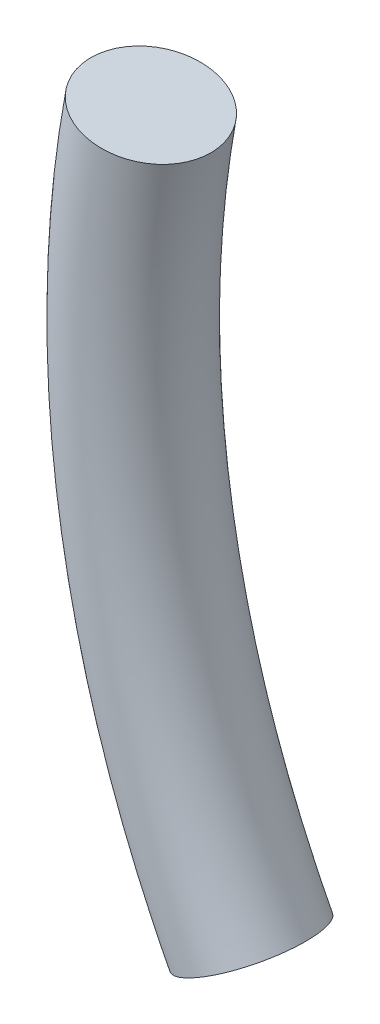
ISO-10303-21;
HEADER;
FILE_DESCRIPTION(('STEP AP214'),'2;1');
FILE_NAME('part.step','',(''),(''),'','','');
FILE_SCHEMA(('AUTOMOTIVE_DESIGN { 1 0 10303 214 1 1 1 1 }'));
ENDSEC;
DATA;
#1=APPLICATION_CONTEXT('core data for automotive mechanical design processes');
#2=APPLICATION_PROTOCOL_DEFINITION('international standard','automotive_design',2000,#1);
#3=PRODUCT_CONTEXT('',#1,'mechanical');
#4=PRODUCT('Part','Part','',(#3));
#5=PRODUCT_RELATED_PRODUCT_CATEGORY('part','',(#4));
#6=PRODUCT_DEFINITION_FORMATION('','',#4);
#7=PRODUCT_DEFINITION_CONTEXT('part definition',#1,'design');
#8=PRODUCT_DEFINITION('design','',#6,#7);
#9=PRODUCT_DEFINITION_SHAPE('','',#8);
#10=(LENGTH_UNIT() NAMED_UNIT(*) SI_UNIT(.MILLI.,.METRE.));
#11=(NAMED_UNIT(*) PLANE_ANGLE_UNIT() SI_UNIT($,.RADIAN.));
#12=(NAMED_UNIT(*) SI_UNIT($,.STERADIAN.) SOLID_ANGLE_UNIT());
#13=UNCERTAINTY_MEASURE_WITH_UNIT(LENGTH_MEASURE(1.E-05),#10,'distance_accuracy_value','');
#14=(GEOMETRIC_REPRESENTATION_CONTEXT(3) GLOBAL_UNCERTAINTY_ASSIGNED_CONTEXT((#13)) GLOBAL_UNIT_ASSIGNED_CONTEXT((#10,
#11,#12)) REPRESENTATION_CONTEXT('',''));
#15=CARTESIAN_POINT('',(0.,0.,0.));
#16=DIRECTION('',(0.,0.,1.));
#17=DIRECTION('',(1.,0.,0.));
#18=AXIS2_PLACEMENT_3D('',#15,#16,#17);
#19=CARTESIAN_POINT('',(0.,0.,-107.5));
#20=DIRECTION('',(0.182886749288035,0.983133987274805,0.));
#21=DIRECTION('',(-0.983133987274805,0.182886749288035,0.));
#22=AXIS2_PLACEMENT_3D('',#19,#20,#21);
#23=PLANE('',#22);
#24=CARTESIAN_POINT('',(-7.13969187066761,1.3281557285636,-102.2302));
#25=CARTESIAN_POINT('',(-7.13969005611854,1.32815539101349,-102.25265524156));
#26=CARTESIAN_POINT('',(-7.13782603214446,1.32780863737703,-102.275130857259));
#27=CARTESIAN_POINT('',(-7.13041033974896,1.32642913886158,-102.319482451298));
#28=CARTESIAN_POINT('',(-7.1248507789372,1.32539492580671,-102.341357041711));
#29=CARTESIAN_POINT('',(-7.11020964362788,1.32267131979037,-102.383809618347));
#30=CARTESIAN_POINT('',(-7.10113435530587,1.32098309620992,-102.404389843003));
#31=CARTESIAN_POINT('',(-7.07970254820175,1.31699626065812,-102.443737337222));
#32=CARTESIAN_POINT('',(-7.0673413746271,1.31469678278256,-102.46250198299));
#33=CARTESIAN_POINT('',(-7.03971500733899,1.30955760890254,-102.497627484938));
#34=CARTESIAN_POINT('',(-7.02445393305132,1.30671867921113,-102.513991693303));
#35=CARTESIAN_POINT('',(-6.99142572735941,1.30057463246674,-102.543904884907));
#36=CARTESIAN_POINT('',(-6.97365511762952,1.2972688683609,-102.557449895039));
#37=CARTESIAN_POINT('',(-6.93614302902663,1.29029071072177,-102.581301941874));
#38=CARTESIAN_POINT('',(-6.91640299508213,1.28661858598021,-102.5916113298));
#39=CARTESIAN_POINT('',(-6.8755003023688,1.27900969380041,-102.608713483024));
#40=CARTESIAN_POINT('',(-6.85433755998862,1.27507291080844,-102.615506041437));
#41=CARTESIAN_POINT('',(-6.81119193830921,1.26704677948037,-102.625380612929));
#42=CARTESIAN_POINT('',(-6.78920908314733,1.2629574356344,-102.628462735124));
#43=CARTESIAN_POINT('',(-6.74504667005647,1.25474215646041,-102.630829316177));
#44=CARTESIAN_POINT('',(-6.72286711212749,1.25061622113238,-102.630113775036));
#45=CARTESIAN_POINT('',(-6.6789402506196,1.24244476026175,-102.624905254934));
#46=CARTESIAN_POINT('',(-6.65719295977223,1.23839923708752,-102.620412164882));
#47=CARTESIAN_POINT('',(-6.61474996716512,1.23050381179611,-102.607776350926));
#48=CARTESIAN_POINT('',(-6.59405420362914,1.22665389818706,-102.599633841699));
#49=CARTESIAN_POINT('',(-6.55428574908882,1.21925600179733,-102.579923114515));
#50=CARTESIAN_POINT('',(-6.53521425212156,1.21570824113648,-102.568352403919));
#51=CARTESIAN_POINT('',(-6.49927871317527,1.2090233599434,-102.542134850302));
#52=CARTESIAN_POINT('',(-6.48241162256708,1.20588567229227,-102.527492330157));
#53=CARTESIAN_POINT('',(-6.45130956160618,1.20009993515072,-102.495513974748));
#54=CARTESIAN_POINT('',(-6.43707834157821,1.1974525833116,-102.478174365578));
#55=CARTESIAN_POINT('',(-6.41170039649541,1.19273167045549,-102.441335318358));
#56=CARTESIAN_POINT('',(-6.4005493134671,1.19065729874982,-102.421838987082));
#57=CARTESIAN_POINT('',(-6.38160367793182,1.18713295136574,-102.381186262625));
#58=CARTESIAN_POINT('',(-6.37381514555994,1.18568409557838,-102.36002697154));
#59=CARTESIAN_POINT('',(-6.36185877606581,1.1834599210728,-102.316713490036));
#60=CARTESIAN_POINT('',(-6.35768323362395,1.18268316897838,-102.294561523395));
#61=CARTESIAN_POINT('',(-6.35391028715783,1.18198130949295,-102.258269762147));
#62=CARTESIAN_POINT('',(-6.35318354640415,1.18184611809916,-102.244238862857));
#63=CARTESIAN_POINT('',(-6.35318649539683,1.18184666668327,-102.20774475844));
#64=CARTESIAN_POINT('',(-6.35505051937092,1.18219342031973,-102.185269142741));
#65=CARTESIAN_POINT('',(-6.36246621176641,1.18357291883518,-102.140917548703));
#66=CARTESIAN_POINT('',(-6.36802577257818,1.18460713189006,-102.119042958289));
#67=CARTESIAN_POINT('',(-6.3826669078875,1.1873307379064,-102.076590381653));
#68=CARTESIAN_POINT('',(-6.3917421962095,1.18901896148685,-102.056010156997));
#69=CARTESIAN_POINT('',(-6.41317400331363,1.19300579703864,-102.016662662778));
#70=CARTESIAN_POINT('',(-6.42553517688828,1.19530527491421,-101.99789801701));
#71=CARTESIAN_POINT('',(-6.45316154417639,1.20044444879422,-101.962772515062));
#72=CARTESIAN_POINT('',(-6.46842261846406,1.20328337848564,-101.946408306697));
#73=CARTESIAN_POINT('',(-6.50145082415597,1.20942742523002,-101.916495115093));
#74=CARTESIAN_POINT('',(-6.51922143388585,1.21273318933587,-101.902950104961));
#75=CARTESIAN_POINT('',(-6.55673352248874,1.21971134697499,-101.879098058126));
#76=CARTESIAN_POINT('',(-6.57647355643324,1.22338347171656,-101.8687886702));
#77=CARTESIAN_POINT('',(-6.61737624914657,1.23099236389635,-101.851686516976));
#78=CARTESIAN_POINT('',(-6.63853899152676,1.23492914688833,-101.844893958563));
#79=CARTESIAN_POINT('',(-6.68168461320617,1.2429552782164,-101.835019387071));
#80=CARTESIAN_POINT('',(-6.70366746836805,1.24704462206237,-101.831937264876));
#81=CARTESIAN_POINT('',(-6.74782988145891,1.25525990123636,-101.829570683823));
#82=CARTESIAN_POINT('',(-6.77000943938789,1.25938583656438,-101.830286224964));
#83=CARTESIAN_POINT('',(-6.81393630089578,1.26755729743501,-101.835494745066));
#84=CARTESIAN_POINT('',(-6.83568359174315,1.27160282060925,-101.839987835118));
#85=CARTESIAN_POINT('',(-6.87812658435026,1.27949824590065,-101.852623649074));
#86=CARTESIAN_POINT('',(-6.89882234788624,1.2833481595097,-101.860766158301));
#87=CARTESIAN_POINT('',(-6.93859080242655,1.29074605589944,-101.880476885485));
#88=CARTESIAN_POINT('',(-6.95766229939381,1.29429381656029,-101.892047596081));
#89=CARTESIAN_POINT('',(-6.99359783834011,1.30097869775336,-101.918265149698));
#90=CARTESIAN_POINT('',(-7.0104649289483,1.30411638540449,-101.932907669844));
#91=CARTESIAN_POINT('',(-7.04156698990919,1.30990212254604,-101.964886025252));
#92=CARTESIAN_POINT('',(-7.05579820993717,1.31254947438517,-101.982225634422));
#93=CARTESIAN_POINT('',(-7.08117615501996,1.31727038724128,-102.019064681642));
#94=CARTESIAN_POINT('',(-7.09232723804828,1.31934475894695,-102.038561012918));
#95=CARTESIAN_POINT('',(-7.11127287358356,1.32286910633102,-102.079213737375));
#96=CARTESIAN_POINT('',(-7.11906140595543,1.32431796211838,-102.10037302846));
#97=CARTESIAN_POINT('',(-7.13101777544957,1.32654213662397,-102.143686509964));
#98=CARTESIAN_POINT('',(-7.13519331789143,1.32731888871838,-102.165838476605));
#99=CARTESIAN_POINT('',(-7.13896626435754,1.32802074820382,-102.202130237853));
#100=CARTESIAN_POINT('',(-7.13969300511123,1.32815593959761,-102.216161137143));
#101=CARTESIAN_POINT('',(-7.13969187066761,1.3281557285636,-102.2302));
#102=B_SPLINE_CURVE_WITH_KNOTS('',3,(#24,#25,#26,#27,#28,#29,#30,#31,#32,#33,#34,#35,#36,#37,
#38,#39,#40,#41,#42,#43,#44,#45,#46,#47,#48,#49,#50,#51,#52,#53,#54,#55,#56,#57,#58,#59,#60,#61,
#62,#63,#64,#65,#66,#67,#68,#69,#70,#71,#72,#73,#74,#75,#76,#77,#78,#79,#80,#81,#82,#83,#84,#85,
#86,#87,#88,#89,#90,#91,#92,#93,#94,#95,#96,#97,#98,#99,#100,#101),.UNSPECIFIED.,.T.,.F.,(4,2,2,
2,2,2,2,2,2,2,2,2,2,2,2,2,2,2,2,2,2,2,2,2,2,2,2,2,2,2,2,2,2,2,2,2,2,2,4),(0.,0.0673217190940813,
0.134787678055445,0.202133559490878,0.269575356418609,0.336922056232666,0.404363034793442,
0.471754892083641,0.539150713403541,0.606544552708794,0.673938392014053,0.741334213333949,
0.808726070624147,0.876167049184931,0.943513748998995,1.01095554592845,1.07830142736559,
1.1457673863287,1.21308910542448,1.25517818200736,1.32249990110144,1.3899658600628,
1.45731174149823,1.52475353842596,1.59210023824002,1.6595412168008,1.726933074091,
1.7943288954109,1.86172273471615,1.92911657402141,1.9965123953413,2.0639042526315,
2.13134523119229,2.19869193100635,2.2661337279358,2.33347960937294,2.40094556833606,
2.46826728743184,2.51035636401471),.UNSPECIFIED.);
#103=CARTESIAN_POINT('',(-7.13969187066761,1.3281557285636,-102.2302));
#104=VERTEX_POINT('',#103);
#105=EDGE_CURVE('E19',#104,#104,#102,.T.);
#106=ORIENTED_EDGE('',*,*,#105,.F.);
#107=EDGE_LOOP('',(#106));
#108=FACE_BOUND('',#107,.T.);
#109=ADVANCED_FACE('F15',(#108),#23,.T.);
#110=CARTESIAN_POINT('',(0.,0.,-107.5));
#111=DIRECTION('',(-0.461160995917257,0.887316480092985,0.));
#112=DIRECTION('',(-0.887316480092985,-0.461160995917257,0.));
#113=AXIS2_PLACEMENT_3D('',#110,#111,#112);
#114=PLANE('',#113);
#115=CARTESIAN_POINT('',(-5.73399510275987,-2.98010343715953,-102.2302));
#116=CARTESIAN_POINT('',(-5.73399674046065,-2.98010428831438,-102.25265524156));
#117=CARTESIAN_POINT('',(-5.7356790942526,-2.98097865046992,-102.275130857259));
#118=CARTESIAN_POINT('',(-5.74237204369692,-2.98445714692593,-102.319482451298));
#119=CARTESIAN_POINT('',(-5.74738976253709,-2.98706498332871,-102.341357041711));
#120=CARTESIAN_POINT('',(-5.76060395390407,-2.99393273546422,-102.383809618347));
#121=CARTESIAN_POINT('',(-5.76879475291411,-2.99818970252566,-102.404389843003));
#122=CARTESIAN_POINT('',(-5.78813778843908,-3.00824277121861,-102.443737337222));
#123=CARTESIAN_POINT('',(-5.79929422608445,-3.01404105628471,-102.46250198299));
#124=CARTESIAN_POINT('',(-5.8242280919635,-3.02699982204509,-102.497627484938));
#125=CARTESIAN_POINT('',(-5.83800180225594,-3.03415837043052,-102.513991693303));
#126=CARTESIAN_POINT('',(-5.86781103639662,-3.04965098936892,-102.543904884907));
#127=CARTESIAN_POINT('',(-5.88384969956839,-3.05798669150837,-102.557449895039));
#128=CARTESIAN_POINT('',(-5.91770581160488,-3.07558257606018,-102.581301941874));
#129=CARTESIAN_POINT('',(-5.93552195636568,-3.08484208069649,-102.5916113298));
#130=CARTESIAN_POINT('',(-5.97243821986027,-3.10402840397646,-102.608713483024));
#131=CARTESIAN_POINT('',(-5.99153841405653,-3.11395526183989,-102.615506041437));
#132=CARTESIAN_POINT('',(-6.03047900776555,-3.1341936811405,-102.625380612929));
#133=CARTESIAN_POINT('',(-6.05031938549341,-3.14450523125551,-102.628462735124));
#134=CARTESIAN_POINT('',(-6.09017767281071,-3.16522059931998,-102.630829316177));
#135=CARTESIAN_POINT('',(-6.11019558240014,-3.17562441726944,-102.630113775036));
#136=CARTESIAN_POINT('',(-6.14984127529573,-3.19622929459308,-102.624905254934));
#137=CARTESIAN_POINT('',(-6.16946904711118,-3.20643034799525,-102.620412164882));
#138=CARTESIAN_POINT('',(-6.20777549088406,-3.22633918340705,-102.607776350926));
#139=CARTESIAN_POINT('',(-6.22645421859694,-3.23604699439421,-102.599633841699));
#140=CARTESIAN_POINT('',(-6.26234678823464,-3.25470127787875,-102.579923114515));
#141=CARTESIAN_POINT('',(-6.27955955249478,-3.2636471902863,-102.568352403919));
#142=CARTESIAN_POINT('',(-6.31199276743882,-3.28050355894388,-102.542134850302));
#143=CARTESIAN_POINT('',(-6.32721596962854,-3.28841544522162,-102.527492330157));
#144=CARTESIAN_POINT('',(-6.35528678358947,-3.30300456287339,-102.495513974748));
#145=CARTESIAN_POINT('',(-6.36813101054744,-3.30968003507369,-102.478174365578));
#146=CARTESIAN_POINT('',(-6.39103558835099,-3.32158412808664,-102.441335318358));
#147=CARTESIAN_POINT('',(-6.40109987243636,-3.32681479310428,-102.421838987082));
#148=CARTESIAN_POINT('',(-6.41819904188211,-3.33570166739082,-102.381186262625));
#149=CARTESIAN_POINT('',(-6.42522849383754,-3.33935505278064,-102.36002697154));
#150=CARTESIAN_POINT('',(-6.4360195801305,-3.34496345543464,-102.316713490036));
#151=CARTESIAN_POINT('',(-6.43978816881724,-3.3469220870514,-102.294561523395));
#152=CARTESIAN_POINT('',(-6.4431933990516,-3.34869187201701,-102.258269762147));
#153=CARTESIAN_POINT('',(-6.44384931071354,-3.3490327660295,-102.244238862857));
#154=CARTESIAN_POINT('',(-6.44384664913349,-3.3490313827385,-102.20774475844));
#155=CARTESIAN_POINT('',(-6.44216429534153,-3.34815702058295,-102.185269142741));
#156=CARTESIAN_POINT('',(-6.43547134589721,-3.34467852412694,-102.140917548703));
#157=CARTESIAN_POINT('',(-6.43045362705704,-3.34207068772417,-102.119042958289));
#158=CARTESIAN_POINT('',(-6.41723943569006,-3.33520293558865,-102.076590381653));
#159=CARTESIAN_POINT('',(-6.40904863668002,-3.33094596852721,-102.056010156997));
#160=CARTESIAN_POINT('',(-6.38970560115505,-3.32089289983426,-102.016662662778));
#161=CARTESIAN_POINT('',(-6.37854916350968,-3.31509461476816,-101.99789801701));
#162=CARTESIAN_POINT('',(-6.35361529763063,-3.30213584900778,-101.962772515062));
#163=CARTESIAN_POINT('',(-6.33984158733819,-3.29497730062235,-101.946408306697));
#164=CARTESIAN_POINT('',(-6.31003235319751,-3.27948468168395,-101.916495115093));
#165=CARTESIAN_POINT('',(-6.29399369002573,-3.2711489795445,-101.902950104961));
#166=CARTESIAN_POINT('',(-6.26013757798925,-3.25355309499269,-101.879098058126));
#167=CARTESIAN_POINT('',(-6.24232143322845,-3.24429359035638,-101.8687886702));
#168=CARTESIAN_POINT('',(-6.20540516973387,-3.22510726707641,-101.851686516976));
#169=CARTESIAN_POINT('',(-6.1863049755376,-3.21518040921298,-101.844893958563));
#170=CARTESIAN_POINT('',(-6.14736438182857,-3.19494198991237,-101.835019387071));
#171=CARTESIAN_POINT('',(-6.12752400410071,-3.18463043979736,-101.831937264876));
#172=CARTESIAN_POINT('',(-6.08766571678342,-3.16391507173289,-101.829570683823));
#173=CARTESIAN_POINT('',(-6.06764780719399,-3.15351125378343,-101.830286224964));
#174=CARTESIAN_POINT('',(-6.0280021142984,-3.13290637645979,-101.835494745066));
#175=CARTESIAN_POINT('',(-6.00837434248295,-3.12270532305762,-101.839987835118));
#176=CARTESIAN_POINT('',(-5.97006789871007,-3.10279648764582,-101.852623649074));
#177=CARTESIAN_POINT('',(-5.95138917099719,-3.09308867665866,-101.860766158301));
#178=CARTESIAN_POINT('',(-5.91549660135949,-3.07443439317413,-101.880476885485));
#179=CARTESIAN_POINT('',(-5.89828383709935,-3.06548848076657,-101.892047596081));
#180=CARTESIAN_POINT('',(-5.86585062215531,-3.04863211210899,-101.918265149698));
#181=CARTESIAN_POINT('',(-5.85062741996559,-3.04072022583125,-101.932907669844));
#182=CARTESIAN_POINT('',(-5.82255660600466,-3.02613110817948,-101.964886025252));
#183=CARTESIAN_POINT('',(-5.80971237904669,-3.01945563597918,-101.982225634422));
#184=CARTESIAN_POINT('',(-5.78680780124313,-3.00755154296623,-102.019064681642));
#185=CARTESIAN_POINT('',(-5.77674351715778,-3.00232087794859,-102.038561012918));
#186=CARTESIAN_POINT('',(-5.75964434771202,-2.99343400366205,-102.079213737375));
#187=CARTESIAN_POINT('',(-5.75261489575659,-2.98978061827223,-102.10037302846));
#188=CARTESIAN_POINT('',(-5.74182380946362,-2.98417221561823,-102.143686509964));
#189=CARTESIAN_POINT('',(-5.73805522077688,-2.98221358400147,-102.165838476605));
#190=CARTESIAN_POINT('',(-5.73464999054253,-2.98044379903586,-102.202130237853));
#191=CARTESIAN_POINT('',(-5.73399407888059,-2.98010290502337,-102.216161137143));
#192=CARTESIAN_POINT('',(-5.73399510275987,-2.98010343715953,-102.2302));
#193=B_SPLINE_CURVE_WITH_KNOTS('',3,(#115,#116,#117,#118,#119,#120,#121,#122,#123,#124,#125,
#126,#127,#128,#129,#130,#131,#132,#133,#134,#135,#136,#137,#138,#139,#140,#141,#142,#143,#144,
#145,#146,#147,#148,#149,#150,#151,#152,#153,#154,#155,#156,#157,#158,#159,#160,#161,#162,#163,
#164,#165,#166,#167,#168,#169,#170,#171,#172,#173,#174,#175,#176,#177,#178,#179,#180,#181,#182,
#183,#184,#185,#186,#187,#188,#189,#190,#191,#192),.UNSPECIFIED.,.T.,.F.,(4,2,2,2,2,2,2,2,2,2,2,
2,2,2,2,2,2,2,2,2,2,2,2,2,2,2,2,2,2,2,2,2,2,2,2,2,2,2,4),(0.,0.0673217190940812,
0.134787678055445,0.202133559490878,0.269575356418609,0.336922056232666,0.404363034793443,
0.471754892083642,0.539150713403542,0.606544552708795,0.673938392014053,0.741334213333949,
0.808726070624146,0.876167049184932,0.943513748998995,1.01095554592844,1.07830142736559,
1.1457673863287,1.21308910542448,1.25517818200736,1.32249990110144,1.3899658600628,
1.45731174149823,1.52475353842596,1.59210023824002,1.6595412168008,1.726933074091,
1.7943288954109,1.86172273471615,1.92911657402141,1.99651239534131,2.0639042526315,
2.13134523119229,2.19869193100635,2.2661337279358,2.33347960937294,2.40094556833606,
2.46826728743184,2.51035636401471),.UNSPECIFIED.);
#194=CARTESIAN_POINT('',(-5.73399510275987,-2.98010343715953,-102.2302));
#195=VERTEX_POINT('',#194);
#196=EDGE_CURVE('E10',#195,#195,#193,.T.);
#197=ORIENTED_EDGE('',*,*,#196,.F.);
#198=EDGE_LOOP('',(#197));
#199=FACE_BOUND('',#198,.T.);
#200=ADVANCED_FACE('F35',(#199),#114,.F.);
#201=CARTESIAN_POINT('',(0.,0.,-102.2302));
#202=DIRECTION('',(0.,0.,1.));
#203=DIRECTION('',(0.182886749288035,0.983133987274804,0.));
#204=AXIS2_PLACEMENT_3D('',#201,#202,#203);
#205=TOROIDAL_SURFACE('',#204,6.86217582046821,0.4);
#206=ORIENTED_EDGE('',*,*,#105,.T.);
#207=EDGE_LOOP('',(#206));
#208=FACE_BOUND('',#207,.T.);
#209=ORIENTED_EDGE('',*,*,#196,.T.);
#210=EDGE_LOOP('',(#209));
#211=FACE_BOUND('',#210,.T.);
#212=ADVANCED_FACE('F37',(#208,#211),#205,.T.);
#213=CLOSED_SHELL('',(#109,#200,#212));
#214=MANIFOLD_SOLID_BREP('B1',#213);
#215=ADVANCED_BREP_SHAPE_REPRESENTATION('',(#18,#214),#14);
#216=SHAPE_DEFINITION_REPRESENTATION(#9,#215);
ENDSEC;
END-ISO-10303-21;
